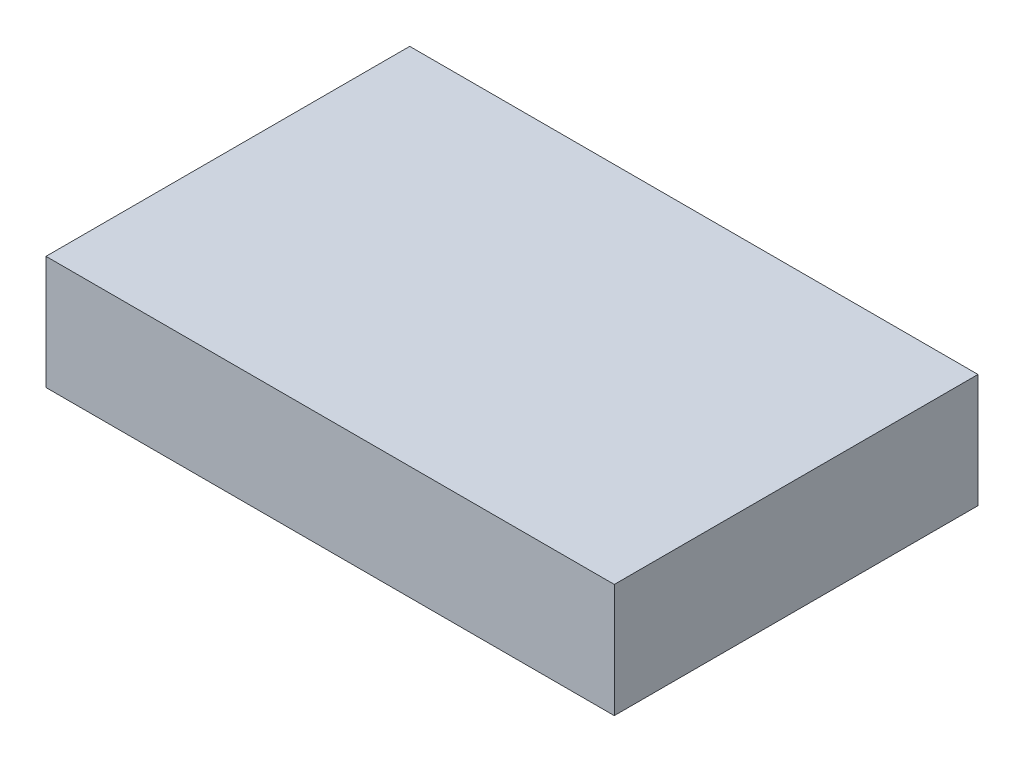
ISO-10303-21;
HEADER;
FILE_DESCRIPTION(('STEP AP214'),'2;1');
FILE_NAME('part.step','',(''),(''),'','','');
FILE_SCHEMA(('AUTOMOTIVE_DESIGN { 1 0 10303 214 1 1 1 1 }'));
ENDSEC;
DATA;
#1=APPLICATION_CONTEXT('core data for automotive mechanical design processes');
#2=APPLICATION_PROTOCOL_DEFINITION('international standard','automotive_design',2000,#1);
#3=PRODUCT_CONTEXT('',#1,'mechanical');
#4=PRODUCT('Part','Part','',(#3));
#5=PRODUCT_RELATED_PRODUCT_CATEGORY('part','',(#4));
#6=PRODUCT_DEFINITION_FORMATION('','',#4);
#7=PRODUCT_DEFINITION_CONTEXT('part definition',#1,'design');
#8=PRODUCT_DEFINITION('design','',#6,#7);
#9=PRODUCT_DEFINITION_SHAPE('','',#8);
#10=(LENGTH_UNIT() NAMED_UNIT(*) SI_UNIT(.MILLI.,.METRE.));
#11=(NAMED_UNIT(*) PLANE_ANGLE_UNIT() SI_UNIT($,.RADIAN.));
#12=(NAMED_UNIT(*) SI_UNIT($,.STERADIAN.) SOLID_ANGLE_UNIT());
#13=UNCERTAINTY_MEASURE_WITH_UNIT(LENGTH_MEASURE(1.E-05),#10,'distance_accuracy_value','');
#14=(GEOMETRIC_REPRESENTATION_CONTEXT(3) GLOBAL_UNCERTAINTY_ASSIGNED_CONTEXT((#13)) GLOBAL_UNIT_ASSIGNED_CONTEXT((#10,
#11,#12)) REPRESENTATION_CONTEXT('',''));
#15=CARTESIAN_POINT('',(0.,0.,0.));
#16=DIRECTION('',(0.,0.,1.));
#17=DIRECTION('',(1.,0.,0.));
#18=AXIS2_PLACEMENT_3D('',#15,#16,#17);
#19=CARTESIAN_POINT('',(0.,0.8,0.));
#20=DIRECTION('',(1.,0.,0.));
#21=DIRECTION('',(0.,0.,-1.));
#22=AXIS2_PLACEMENT_3D('',#19,#20,#21);
#23=PLANE('',#22);
#24=DIRECTION('',(0.,0.,1.));
#25=VECTOR('',#24,1.);
#26=CARTESIAN_POINT('',(0.,0.,0.));
#27=LINE('',#26,#25);
#28=CARTESIAN_POINT('',(0.,0.,-3.2));
#29=VERTEX_POINT('',#28);
#30=CARTESIAN_POINT('',(0.,0.,0.));
#31=VERTEX_POINT('',#30);
#32=EDGE_CURVE('E78',#29,#31,#27,.T.);
#33=ORIENTED_EDGE('',*,*,#32,.T.);
#34=DIRECTION('',(0.,-1.,0.));
#35=VECTOR('',#34,1.);
#36=CARTESIAN_POINT('',(0.,0.8,0.));
#37=LINE('',#36,#35);
#38=CARTESIAN_POINT('',(0.,1.,0.));
#39=VERTEX_POINT('',#38);
#40=EDGE_CURVE('E11',#39,#31,#37,.T.);
#41=ORIENTED_EDGE('',*,*,#40,.F.);
#42=DIRECTION('',(0.,0.,1.));
#43=VECTOR('',#42,1.);
#44=CARTESIAN_POINT('',(0.,1.,-3.2));
#45=LINE('',#44,#43);
#46=CARTESIAN_POINT('',(0.,1.,-3.2));
#47=VERTEX_POINT('',#46);
#48=EDGE_CURVE('E76',#47,#39,#45,.T.);
#49=ORIENTED_EDGE('',*,*,#48,.F.);
#50=DIRECTION('',(0.,-1.,0.));
#51=VECTOR('',#50,1.);
#52=CARTESIAN_POINT('',(0.,0.8,-3.2));
#53=LINE('',#52,#51);
#54=EDGE_CURVE('E101',#47,#29,#53,.T.);
#55=ORIENTED_EDGE('',*,*,#54,.T.);
#56=EDGE_LOOP('',(#33,#41,#49,#55));
#57=FACE_BOUND('',#56,.T.);
#58=ADVANCED_FACE('F33',(#57),#23,.F.);
#59=CARTESIAN_POINT('',(0.,0.8,0.));
#60=DIRECTION('',(0.,0.,-1.));
#61=DIRECTION('',(-1.,0.,0.));
#62=AXIS2_PLACEMENT_3D('',#59,#60,#61);
#63=PLANE('',#62);
#64=DIRECTION('',(1.,0.,0.));
#65=VECTOR('',#64,1.);
#66=CARTESIAN_POINT('',(0.,0.,0.));
#67=LINE('',#66,#65);
#68=CARTESIAN_POINT('',(5.,0.,0.));
#69=VERTEX_POINT('',#68);
#70=EDGE_CURVE('E97',#31,#69,#67,.T.);
#71=ORIENTED_EDGE('',*,*,#70,.T.);
#72=DIRECTION('',(0.,-1.,0.));
#73=VECTOR('',#72,1.);
#74=CARTESIAN_POINT('',(5.,0.8,0.));
#75=LINE('',#74,#73);
#76=CARTESIAN_POINT('',(5.,1.,0.));
#77=VERTEX_POINT('',#76);
#78=EDGE_CURVE('E40',#77,#69,#75,.T.);
#79=ORIENTED_EDGE('',*,*,#78,.F.);
#80=DIRECTION('',(1.,0.,0.));
#81=VECTOR('',#80,1.);
#82=CARTESIAN_POINT('',(0.,1.,0.));
#83=LINE('',#82,#81);
#84=EDGE_CURVE('E81',#39,#77,#83,.T.);
#85=ORIENTED_EDGE('',*,*,#84,.F.);
#86=ORIENTED_EDGE('',*,*,#40,.T.);
#87=EDGE_LOOP('',(#71,#79,#85,#86));
#88=FACE_BOUND('',#87,.T.);
#89=ADVANCED_FACE('F82',(#88),#63,.F.);
#90=CARTESIAN_POINT('',(5.,0.8,0.));
#91=DIRECTION('',(-1.,0.,0.));
#92=DIRECTION('',(0.,0.,1.));
#93=AXIS2_PLACEMENT_3D('',#90,#91,#92);
#94=PLANE('',#93);
#95=DIRECTION('',(0.,0.,-1.));
#96=VECTOR('',#95,1.);
#97=CARTESIAN_POINT('',(5.,0.,0.));
#98=LINE('',#97,#96);
#99=CARTESIAN_POINT('',(5.,0.,-3.2));
#100=VERTEX_POINT('',#99);
#101=EDGE_CURVE('E55',#69,#100,#98,.T.);
#102=ORIENTED_EDGE('',*,*,#101,.T.);
#103=DIRECTION('',(0.,-1.,0.));
#104=VECTOR('',#103,1.);
#105=CARTESIAN_POINT('',(5.,0.8,-3.2));
#106=LINE('',#105,#104);
#107=CARTESIAN_POINT('',(5.,1.,-3.2));
#108=VERTEX_POINT('',#107);
#109=EDGE_CURVE('E103',#108,#100,#106,.T.);
#110=ORIENTED_EDGE('',*,*,#109,.F.);
#111=DIRECTION('',(0.,0.,-1.));
#112=VECTOR('',#111,1.);
#113=CARTESIAN_POINT('',(5.,1.,-3.2));
#114=LINE('',#113,#112);
#115=EDGE_CURVE('E86',#77,#108,#114,.T.);
#116=ORIENTED_EDGE('',*,*,#115,.F.);
#117=ORIENTED_EDGE('',*,*,#78,.T.);
#118=EDGE_LOOP('',(#102,#110,#116,#117));
#119=FACE_BOUND('',#118,.T.);
#120=ADVANCED_FACE('F104',(#119),#94,.F.);
#121=CARTESIAN_POINT('',(0.,0.8,-3.2));
#122=DIRECTION('',(0.,0.,1.));
#123=DIRECTION('',(1.,0.,0.));
#124=AXIS2_PLACEMENT_3D('',#121,#122,#123);
#125=PLANE('',#124);
#126=DIRECTION('',(-1.,0.,0.));
#127=VECTOR('',#126,1.);
#128=CARTESIAN_POINT('',(0.,0.,-3.2));
#129=LINE('',#128,#127);
#130=EDGE_CURVE('E47',#100,#29,#129,.T.);
#131=ORIENTED_EDGE('',*,*,#130,.T.);
#132=ORIENTED_EDGE('',*,*,#54,.F.);
#133=DIRECTION('',(-1.,0.,0.));
#134=VECTOR('',#133,1.);
#135=CARTESIAN_POINT('',(0.,1.,-3.2));
#136=LINE('',#135,#134);
#137=EDGE_CURVE('E91',#108,#47,#136,.T.);
#138=ORIENTED_EDGE('',*,*,#137,.F.);
#139=ORIENTED_EDGE('',*,*,#109,.T.);
#140=EDGE_LOOP('',(#131,#132,#138,#139));
#141=FACE_BOUND('',#140,.T.);
#142=ADVANCED_FACE('F108',(#141),#125,.F.);
#143=CARTESIAN_POINT('',(0.,0.,0.));
#144=DIRECTION('',(0.,-1.,0.));
#145=DIRECTION('',(0.,0.,-1.));
#146=AXIS2_PLACEMENT_3D('',#143,#144,#145);
#147=PLANE('',#146);
#148=ORIENTED_EDGE('',*,*,#32,.F.);
#149=ORIENTED_EDGE('',*,*,#130,.F.);
#150=ORIENTED_EDGE('',*,*,#101,.F.);
#151=ORIENTED_EDGE('',*,*,#70,.F.);
#152=EDGE_LOOP('',(#148,#149,#150,#151));
#153=FACE_BOUND('',#152,.T.);
#154=ADVANCED_FACE('F106',(#153),#147,.T.);
#155=CARTESIAN_POINT('',(0.,1.,0.));
#156=DIRECTION('',(0.,1.,0.));
#157=DIRECTION('',(0.,0.,1.));
#158=AXIS2_PLACEMENT_3D('',#155,#156,#157);
#159=PLANE('',#158);
#160=ORIENTED_EDGE('',*,*,#48,.T.);
#161=ORIENTED_EDGE('',*,*,#84,.T.);
#162=ORIENTED_EDGE('',*,*,#115,.T.);
#163=ORIENTED_EDGE('',*,*,#137,.T.);
#164=EDGE_LOOP('',(#160,#161,#162,#163));
#165=FACE_BOUND('',#164,.T.);
#166=ADVANCED_FACE('F89',(#165),#159,.T.);
#167=CLOSED_SHELL('',(#58,#89,#120,#142,#154,#166));
#168=MANIFOLD_SOLID_BREP('B2',#167);
#169=ADVANCED_BREP_SHAPE_REPRESENTATION('',(#18,#168),#14);
#170=SHAPE_DEFINITION_REPRESENTATION(#9,#169);
ENDSEC;
END-ISO-10303-21;
